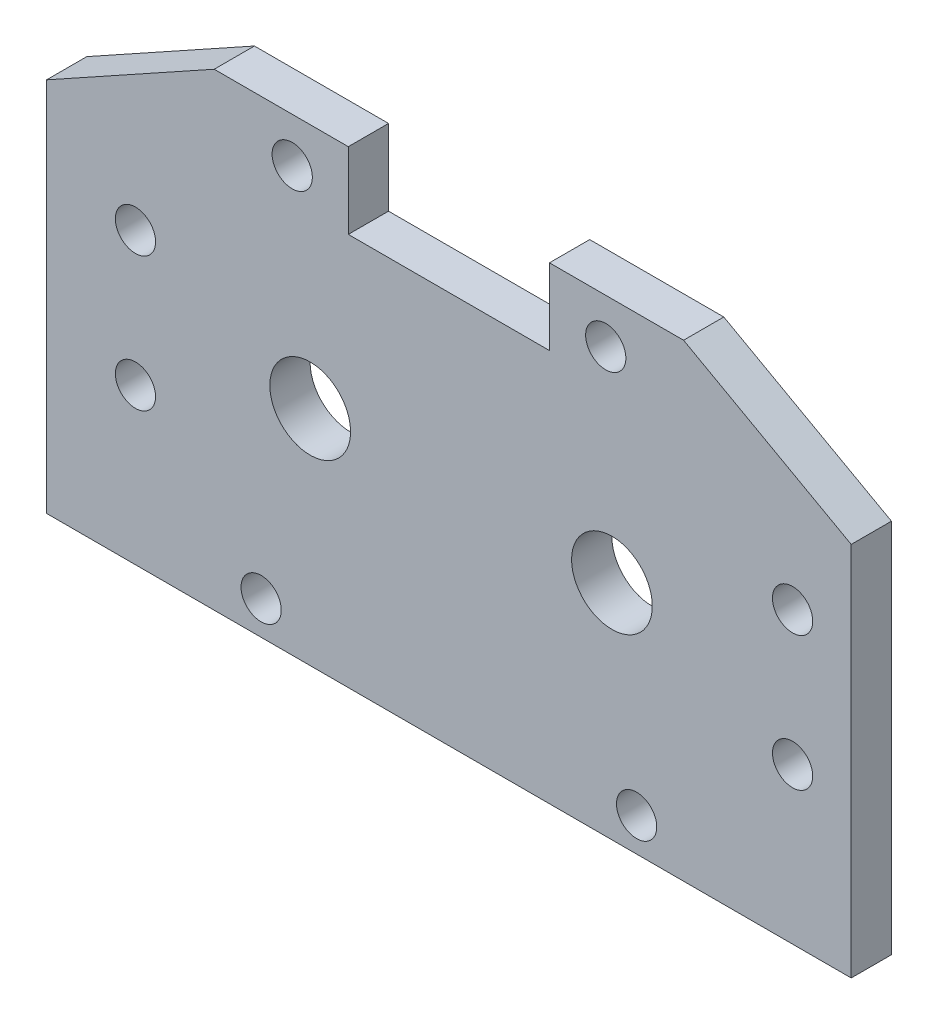
ISO-10303-21;
HEADER;
FILE_DESCRIPTION(('STEP AP214'),'2;1');
FILE_NAME('part.step','',(''),(''),'','','');
FILE_SCHEMA(('AUTOMOTIVE_DESIGN { 1 0 10303 214 1 1 1 1 }'));
ENDSEC;
DATA;
#1=APPLICATION_CONTEXT('core data for automotive mechanical design processes');
#2=APPLICATION_PROTOCOL_DEFINITION('international standard','automotive_design',2000,#1);
#3=PRODUCT_CONTEXT('',#1,'mechanical');
#4=PRODUCT('Part','Part','',(#3));
#5=PRODUCT_RELATED_PRODUCT_CATEGORY('part','',(#4));
#6=PRODUCT_DEFINITION_FORMATION('','',#4);
#7=PRODUCT_DEFINITION_CONTEXT('part definition',#1,'design');
#8=PRODUCT_DEFINITION('design','',#6,#7);
#9=PRODUCT_DEFINITION_SHAPE('','',#8);
#10=(LENGTH_UNIT() NAMED_UNIT(*) SI_UNIT(.MILLI.,.METRE.));
#11=(NAMED_UNIT(*) PLANE_ANGLE_UNIT() SI_UNIT($,.RADIAN.));
#12=(NAMED_UNIT(*) SI_UNIT($,.STERADIAN.) SOLID_ANGLE_UNIT());
#13=UNCERTAINTY_MEASURE_WITH_UNIT(LENGTH_MEASURE(1.E-05),#10,'distance_accuracy_value','');
#14=(GEOMETRIC_REPRESENTATION_CONTEXT(3) GLOBAL_UNCERTAINTY_ASSIGNED_CONTEXT((#13)) GLOBAL_UNIT_ASSIGNED_CONTEXT((#10,
#11,#12)) REPRESENTATION_CONTEXT('',''));
#15=CARTESIAN_POINT('',(0.,0.,0.));
#16=DIRECTION('',(0.,0.,1.));
#17=DIRECTION('',(1.,0.,0.));
#18=AXIS2_PLACEMENT_3D('',#15,#16,#17);
#19=CARTESIAN_POINT('',(7.5,0.,3.));
#20=DIRECTION('',(1.,0.,0.));
#21=DIRECTION('',(0.,0.,-1.));
#22=AXIS2_PLACEMENT_3D('',#19,#20,#21);
#23=PLANE('',#22);
#24=DIRECTION('',(0.,-1.,0.));
#25=VECTOR('',#24,1.);
#26=CARTESIAN_POINT('',(7.5,0.,0.));
#27=LINE('',#26,#25);
#28=CARTESIAN_POINT('',(7.5,5.66583768810425,0.));
#29=VERTEX_POINT('',#28);
#30=CARTESIAN_POINT('',(7.5,0.,0.));
#31=VERTEX_POINT('',#30);
#32=EDGE_CURVE('E146',#29,#31,#27,.T.);
#33=ORIENTED_EDGE('',*,*,#32,.T.);
#34=DIRECTION('',(0.,0.,-1.));
#35=VECTOR('',#34,1.);
#36=CARTESIAN_POINT('',(7.5,0.,3.));
#37=LINE('',#36,#35);
#38=CARTESIAN_POINT('',(7.5,0.,3.));
#39=VERTEX_POINT('',#38);
#40=EDGE_CURVE('E11',#39,#31,#37,.T.);
#41=ORIENTED_EDGE('',*,*,#40,.F.);
#42=DIRECTION('',(0.,-1.,0.));
#43=VECTOR('',#42,1.);
#44=CARTESIAN_POINT('',(7.5,0.,3.));
#45=LINE('',#44,#43);
#46=CARTESIAN_POINT('',(7.5,5.66583768810425,3.));
#47=VERTEX_POINT('',#46);
#48=EDGE_CURVE('E165',#47,#39,#45,.T.);
#49=ORIENTED_EDGE('',*,*,#48,.F.);
#50=DIRECTION('',(0.,0.,-1.));
#51=VECTOR('',#50,1.);
#52=CARTESIAN_POINT('',(7.5,5.66583768810425,3.));
#53=LINE('',#52,#51);
#54=EDGE_CURVE('E142',#47,#29,#53,.T.);
#55=ORIENTED_EDGE('',*,*,#54,.T.);
#56=EDGE_LOOP('',(#33,#41,#49,#55));
#57=FACE_BOUND('',#56,.T.);
#58=ADVANCED_FACE('F38',(#57),#23,.F.);
#59=CARTESIAN_POINT('',(-7.5,0.,3.));
#60=DIRECTION('',(0.,-1.,0.));
#61=DIRECTION('',(0.,0.,-1.));
#62=AXIS2_PLACEMENT_3D('',#59,#60,#61);
#63=PLANE('',#62);
#64=DIRECTION('',(-1.,0.,0.));
#65=VECTOR('',#64,1.);
#66=CARTESIAN_POINT('',(-7.5,0.,0.));
#67=LINE('',#66,#65);
#68=CARTESIAN_POINT('',(-7.5,0.,0.));
#69=VERTEX_POINT('',#68);
#70=EDGE_CURVE('E149',#31,#69,#67,.T.);
#71=ORIENTED_EDGE('',*,*,#70,.T.);
#72=DIRECTION('',(0.,0.,-1.));
#73=VECTOR('',#72,1.);
#74=CARTESIAN_POINT('',(-7.5,0.,3.));
#75=LINE('',#74,#73);
#76=CARTESIAN_POINT('',(-7.5,0.,3.));
#77=VERTEX_POINT('',#76);
#78=EDGE_CURVE('E46',#77,#69,#75,.T.);
#79=ORIENTED_EDGE('',*,*,#78,.F.);
#80=DIRECTION('',(-1.,0.,0.));
#81=VECTOR('',#80,1.);
#82=CARTESIAN_POINT('',(-7.5,0.,3.));
#83=LINE('',#82,#81);
#84=EDGE_CURVE('E103',#39,#77,#83,.T.);
#85=ORIENTED_EDGE('',*,*,#84,.F.);
#86=ORIENTED_EDGE('',*,*,#40,.T.);
#87=EDGE_LOOP('',(#71,#79,#85,#86));
#88=FACE_BOUND('',#87,.T.);
#89=ADVANCED_FACE('F318',(#88),#63,.F.);
#90=CARTESIAN_POINT('',(-7.5,0.,3.));
#91=DIRECTION('',(-1.,0.,0.));
#92=DIRECTION('',(0.,0.,1.));
#93=AXIS2_PLACEMENT_3D('',#90,#91,#92);
#94=PLANE('',#93);
#95=DIRECTION('',(0.,1.,0.));
#96=VECTOR('',#95,1.);
#97=CARTESIAN_POINT('',(-7.5,0.,0.));
#98=LINE('',#97,#96);
#99=CARTESIAN_POINT('',(-7.5,5.66583768810425,0.));
#100=VERTEX_POINT('',#99);
#101=EDGE_CURVE('E152',#69,#100,#98,.T.);
#102=ORIENTED_EDGE('',*,*,#101,.T.);
#103=DIRECTION('',(0.,0.,-1.));
#104=VECTOR('',#103,1.);
#105=CARTESIAN_POINT('',(-7.5,5.66583768810425,3.));
#106=LINE('',#105,#104);
#107=CARTESIAN_POINT('',(-7.5,5.66583768810425,3.));
#108=VERTEX_POINT('',#107);
#109=EDGE_CURVE('E178',#108,#100,#106,.T.);
#110=ORIENTED_EDGE('',*,*,#109,.F.);
#111=DIRECTION('',(0.,1.,0.));
#112=VECTOR('',#111,1.);
#113=CARTESIAN_POINT('',(-7.5,0.,3.));
#114=LINE('',#113,#112);
#115=EDGE_CURVE('E186',#77,#108,#114,.T.);
#116=ORIENTED_EDGE('',*,*,#115,.F.);
#117=ORIENTED_EDGE('',*,*,#78,.T.);
#118=EDGE_LOOP('',(#102,#110,#116,#117));
#119=FACE_BOUND('',#118,.T.);
#120=ADVANCED_FACE('F184',(#119),#94,.F.);
#121=CARTESIAN_POINT('',(-7.5,5.66583768810425,3.));
#122=DIRECTION('',(0.,-1.,0.));
#123=DIRECTION('',(1.,0.,0.));
#124=AXIS2_PLACEMENT_3D('',#121,#122,#123);
#125=PLANE('',#124);
#126=DIRECTION('',(-1.,0.,0.));
#127=VECTOR('',#126,1.);
#128=CARTESIAN_POINT('',(-7.5,5.66583768810425,0.));
#129=LINE('',#128,#127);
#130=CARTESIAN_POINT('',(-17.5,5.66583768810424,0.));
#131=VERTEX_POINT('',#130);
#132=EDGE_CURVE('E154',#100,#131,#129,.T.);
#133=ORIENTED_EDGE('',*,*,#132,.T.);
#134=DIRECTION('',(0.,0.,-1.));
#135=VECTOR('',#134,1.);
#136=CARTESIAN_POINT('',(-17.5,5.66583768810424,3.));
#137=LINE('',#136,#135);
#138=CARTESIAN_POINT('',(-17.5,5.66583768810424,3.));
#139=VERTEX_POINT('',#138);
#140=EDGE_CURVE('E175',#139,#131,#137,.T.);
#141=ORIENTED_EDGE('',*,*,#140,.F.);
#142=DIRECTION('',(-1.,0.,0.));
#143=VECTOR('',#142,1.);
#144=CARTESIAN_POINT('',(-7.5,5.66583768810425,3.));
#145=LINE('',#144,#143);
#146=EDGE_CURVE('E204',#108,#139,#145,.T.);
#147=ORIENTED_EDGE('',*,*,#146,.F.);
#148=ORIENTED_EDGE('',*,*,#109,.T.);
#149=EDGE_LOOP('',(#133,#141,#147,#148));
#150=FACE_BOUND('',#149,.T.);
#151=ADVANCED_FACE('F195',(#150),#125,.F.);
#152=CARTESIAN_POINT('',(-17.5,5.66583768810424,3.));
#153=DIRECTION('',(0.485146223738787,-0.874433040084828,0.));
#154=DIRECTION('',(0.874433040084828,0.485146223738787,0.));
#155=AXIS2_PLACEMENT_3D('',#152,#153,#154);
#156=PLANE('',#155);
#157=DIRECTION('',(-0.874433040084828,-0.485146223738787,0.));
#158=VECTOR('',#157,1.);
#159=CARTESIAN_POINT('',(-17.5,5.66583768810424,0.));
#160=LINE('',#159,#158);
#161=CARTESIAN_POINT('',(-30.,-1.26931631310612,0.));
#162=VERTEX_POINT('',#161);
#163=EDGE_CURVE('E156',#131,#162,#160,.T.);
#164=ORIENTED_EDGE('',*,*,#163,.T.);
#165=DIRECTION('',(0.,0.,-1.));
#166=VECTOR('',#165,1.);
#167=CARTESIAN_POINT('',(-30.,-1.26931631310612,3.));
#168=LINE('',#167,#166);
#169=CARTESIAN_POINT('',(-30.,-1.26931631310612,3.));
#170=VERTEX_POINT('',#169);
#171=EDGE_CURVE('E172',#170,#162,#168,.T.);
#172=ORIENTED_EDGE('',*,*,#171,.F.);
#173=DIRECTION('',(-0.874433040084828,-0.485146223738787,0.));
#174=VECTOR('',#173,1.);
#175=CARTESIAN_POINT('',(-17.5,5.66583768810424,3.));
#176=LINE('',#175,#174);
#177=EDGE_CURVE('E201',#139,#170,#176,.T.);
#178=ORIENTED_EDGE('',*,*,#177,.F.);
#179=ORIENTED_EDGE('',*,*,#140,.T.);
#180=EDGE_LOOP('',(#164,#172,#178,#179));
#181=FACE_BOUND('',#180,.T.);
#182=ADVANCED_FACE('F199',(#181),#156,.F.);
#183=CARTESIAN_POINT('',(-30.,-1.26931631310612,3.));
#184=DIRECTION('',(1.,0.,0.));
#185=DIRECTION('',(0.,1.,0.));
#186=AXIS2_PLACEMENT_3D('',#183,#184,#185);
#187=PLANE('',#186);
#188=DIRECTION('',(0.,-1.,0.));
#189=VECTOR('',#188,1.);
#190=CARTESIAN_POINT('',(-30.,-1.26931631310612,0.));
#191=LINE('',#190,#189);
#192=CARTESIAN_POINT('',(-30.,-29.2693163131061,0.));
#193=VERTEX_POINT('',#192);
#194=EDGE_CURVE('E158',#162,#193,#191,.T.);
#195=ORIENTED_EDGE('',*,*,#194,.T.);
#196=DIRECTION('',(0.,0.,-1.));
#197=VECTOR('',#196,1.);
#198=CARTESIAN_POINT('',(-30.,-29.2693163131061,3.));
#199=LINE('',#198,#197);
#200=CARTESIAN_POINT('',(-30.,-29.2693163131061,3.));
#201=VERTEX_POINT('',#200);
#202=EDGE_CURVE('E169',#201,#193,#199,.T.);
#203=ORIENTED_EDGE('',*,*,#202,.F.);
#204=DIRECTION('',(0.,-1.,0.));
#205=VECTOR('',#204,1.);
#206=CARTESIAN_POINT('',(-30.,-1.26931631310612,3.));
#207=LINE('',#206,#205);
#208=EDGE_CURVE('E203',#170,#201,#207,.T.);
#209=ORIENTED_EDGE('',*,*,#208,.F.);
#210=ORIENTED_EDGE('',*,*,#171,.T.);
#211=EDGE_LOOP('',(#195,#203,#209,#210));
#212=FACE_BOUND('',#211,.T.);
#213=ADVANCED_FACE('F330',(#212),#187,.F.);
#214=CARTESIAN_POINT('',(30.,-29.2693163131061,3.));
#215=DIRECTION('',(0.,1.,0.));
#216=DIRECTION('',(-1.,0.,0.));
#217=AXIS2_PLACEMENT_3D('',#214,#215,#216);
#218=PLANE('',#217);
#219=DIRECTION('',(1.,0.,0.));
#220=VECTOR('',#219,1.);
#221=CARTESIAN_POINT('',(30.,-29.2693163131061,0.));
#222=LINE('',#221,#220);
#223=CARTESIAN_POINT('',(30.,-29.2693163131061,0.));
#224=VERTEX_POINT('',#223);
#225=EDGE_CURVE('E160',#193,#224,#222,.T.);
#226=ORIENTED_EDGE('',*,*,#225,.T.);
#227=DIRECTION('',(0.,0.,-1.));
#228=VECTOR('',#227,1.);
#229=CARTESIAN_POINT('',(30.,-29.2693163131061,3.));
#230=LINE('',#229,#228);
#231=CARTESIAN_POINT('',(30.,-29.2693163131061,3.));
#232=VERTEX_POINT('',#231);
#233=EDGE_CURVE('E137',#232,#224,#230,.T.);
#234=ORIENTED_EDGE('',*,*,#233,.F.);
#235=DIRECTION('',(1.,0.,0.));
#236=VECTOR('',#235,1.);
#237=CARTESIAN_POINT('',(30.,-29.2693163131061,3.));
#238=LINE('',#237,#236);
#239=EDGE_CURVE('E128',#201,#232,#238,.T.);
#240=ORIENTED_EDGE('',*,*,#239,.F.);
#241=ORIENTED_EDGE('',*,*,#202,.T.);
#242=EDGE_LOOP('',(#226,#234,#240,#241));
#243=FACE_BOUND('',#242,.T.);
#244=ADVANCED_FACE('F327',(#243),#218,.F.);
#245=CARTESIAN_POINT('',(30.,-1.26931631310611,3.));
#246=DIRECTION('',(-1.,0.,0.));
#247=DIRECTION('',(0.,-1.,0.));
#248=AXIS2_PLACEMENT_3D('',#245,#246,#247);
#249=PLANE('',#248);
#250=DIRECTION('',(0.,1.,0.));
#251=VECTOR('',#250,1.);
#252=CARTESIAN_POINT('',(30.,-1.26931631310611,0.));
#253=LINE('',#252,#251);
#254=CARTESIAN_POINT('',(30.,-1.26931631310611,0.));
#255=VERTEX_POINT('',#254);
#256=EDGE_CURVE('E136',#224,#255,#253,.T.);
#257=ORIENTED_EDGE('',*,*,#256,.T.);
#258=DIRECTION('',(0.,0.,-1.));
#259=VECTOR('',#258,1.);
#260=CARTESIAN_POINT('',(30.,-1.26931631310611,3.));
#261=LINE('',#260,#259);
#262=CARTESIAN_POINT('',(30.,-1.26931631310611,3.));
#263=VERTEX_POINT('',#262);
#264=EDGE_CURVE('E133',#263,#255,#261,.T.);
#265=ORIENTED_EDGE('',*,*,#264,.F.);
#266=DIRECTION('',(0.,1.,0.));
#267=VECTOR('',#266,1.);
#268=CARTESIAN_POINT('',(30.,-1.26931631310611,3.));
#269=LINE('',#268,#267);
#270=EDGE_CURVE('E122',#232,#263,#269,.T.);
#271=ORIENTED_EDGE('',*,*,#270,.F.);
#272=ORIENTED_EDGE('',*,*,#233,.T.);
#273=EDGE_LOOP('',(#257,#265,#271,#272));
#274=FACE_BOUND('',#273,.T.);
#275=ADVANCED_FACE('F134',(#274),#249,.F.);
#276=CARTESIAN_POINT('',(17.5,5.66583768810425,3.));
#277=DIRECTION('',(-0.485146223738787,-0.874433040084828,0.));
#278=DIRECTION('',(0.874433040084828,-0.485146223738787,0.));
#279=AXIS2_PLACEMENT_3D('',#276,#277,#278);
#280=PLANE('',#279);
#281=DIRECTION('',(-0.874433040084828,0.485146223738787,0.));
#282=VECTOR('',#281,1.);
#283=CARTESIAN_POINT('',(17.5,5.66583768810425,0.));
#284=LINE('',#283,#282);
#285=CARTESIAN_POINT('',(17.5,5.66583768810425,0.));
#286=VERTEX_POINT('',#285);
#287=EDGE_CURVE('E89',#255,#286,#284,.T.);
#288=ORIENTED_EDGE('',*,*,#287,.T.);
#289=DIRECTION('',(0.,0.,-1.));
#290=VECTOR('',#289,1.);
#291=CARTESIAN_POINT('',(17.5,5.66583768810425,3.));
#292=LINE('',#291,#290);
#293=CARTESIAN_POINT('',(17.5,5.66583768810425,3.));
#294=VERTEX_POINT('',#293);
#295=EDGE_CURVE('E138',#294,#286,#292,.T.);
#296=ORIENTED_EDGE('',*,*,#295,.F.);
#297=DIRECTION('',(-0.874433040084828,0.485146223738787,0.));
#298=VECTOR('',#297,1.);
#299=CARTESIAN_POINT('',(17.5,5.66583768810425,3.));
#300=LINE('',#299,#298);
#301=EDGE_CURVE('E126',#263,#294,#300,.T.);
#302=ORIENTED_EDGE('',*,*,#301,.F.);
#303=ORIENTED_EDGE('',*,*,#264,.T.);
#304=EDGE_LOOP('',(#288,#296,#302,#303));
#305=FACE_BOUND('',#304,.T.);
#306=ADVANCED_FACE('F140',(#305),#280,.F.);
#307=CARTESIAN_POINT('',(7.5,5.66583768810425,3.));
#308=DIRECTION('',(0.,-1.,0.));
#309=DIRECTION('',(0.,0.,-1.));
#310=AXIS2_PLACEMENT_3D('',#307,#308,#309);
#311=PLANE('',#310);
#312=DIRECTION('',(-1.,0.,0.));
#313=VECTOR('',#312,1.);
#314=CARTESIAN_POINT('',(7.5,5.66583768810425,0.));
#315=LINE('',#314,#313);
#316=EDGE_CURVE('E95',#286,#29,#315,.T.);
#317=ORIENTED_EDGE('',*,*,#316,.T.);
#318=ORIENTED_EDGE('',*,*,#54,.F.);
#319=DIRECTION('',(-1.,0.,0.));
#320=VECTOR('',#319,1.);
#321=CARTESIAN_POINT('',(7.5,5.66583768810425,3.));
#322=LINE('',#321,#320);
#323=EDGE_CURVE('E54',#294,#47,#322,.T.);
#324=ORIENTED_EDGE('',*,*,#323,.F.);
#325=ORIENTED_EDGE('',*,*,#295,.T.);
#326=EDGE_LOOP('',(#317,#318,#324,#325));
#327=FACE_BOUND('',#326,.T.);
#328=ADVANCED_FACE('F382',(#327),#311,.F.);
#329=CARTESIAN_POINT('',(0.,0.,3.));
#330=DIRECTION('',(0.,0.,-1.));
#331=DIRECTION('',(-1.,0.,0.));
#332=AXIS2_PLACEMENT_3D('',#329,#330,#331);
#333=PLANE('',#332);
#334=CARTESIAN_POINT('',(-14.,-26.7693163131061,3.));
#335=DIRECTION('',(0.,0.,-1.));
#336=DIRECTION('',(-1.,0.,0.));
#337=AXIS2_PLACEMENT_3D('',#334,#335,#336);
#338=CIRCLE('',#337,1.5);
#339=CARTESIAN_POINT('',(-15.5,-26.7693163131061,3.));
#340=VERTEX_POINT('',#339);
#341=EDGE_CURVE('E252',#340,#340,#338,.T.);
#342=ORIENTED_EDGE('',*,*,#341,.T.);
#343=EDGE_LOOP('',(#342));
#344=FACE_BOUND('',#343,.T.);
#345=CARTESIAN_POINT('',(14.,-26.7693163131061,3.));
#346=DIRECTION('',(0.,0.,-1.));
#347=DIRECTION('',(-1.,0.,0.));
#348=AXIS2_PLACEMENT_3D('',#345,#346,#347);
#349=CIRCLE('',#348,1.5);
#350=CARTESIAN_POINT('',(12.5,-26.7693163131061,3.));
#351=VERTEX_POINT('',#350);
#352=EDGE_CURVE('E263',#351,#351,#349,.T.);
#353=ORIENTED_EDGE('',*,*,#352,.T.);
#354=EDGE_LOOP('',(#353));
#355=FACE_BOUND('',#354,.T.);
#356=CARTESIAN_POINT('',(-10.3415528202247,-12.6693163131061,3.));
#357=DIRECTION('',(0.,0.,-1.));
#358=DIRECTION('',(-1.,0.,0.));
#359=AXIS2_PLACEMENT_3D('',#356,#357,#358);
#360=CIRCLE('',#359,3.01000000000002);
#361=CARTESIAN_POINT('',(-13.3515528202248,-12.6693163131061,3.));
#362=VERTEX_POINT('',#361);
#363=EDGE_CURVE('E240',#362,#362,#360,.T.);
#364=ORIENTED_EDGE('',*,*,#363,.T.);
#365=EDGE_LOOP('',(#364));
#366=FACE_BOUND('',#365,.T.);
#367=CARTESIAN_POINT('',(12.1584471796846,-12.6693801884365,3.));
#368=DIRECTION('',(0.,0.,-1.));
#369=DIRECTION('',(-1.,0.,0.));
#370=AXIS2_PLACEMENT_3D('',#367,#368,#369);
#371=CIRCLE('',#370,3.01);
#372=CARTESIAN_POINT('',(9.14844717968459,-12.6693801884365,3.));
#373=VERTEX_POINT('',#372);
#374=EDGE_CURVE('E251',#373,#373,#371,.T.);
#375=ORIENTED_EDGE('',*,*,#374,.T.);
#376=EDGE_LOOP('',(#375));
#377=FACE_BOUND('',#376,.T.);
#378=CARTESIAN_POINT('',(11.6968329642972,2.35034329740187,3.));
#379=DIRECTION('',(0.,0.,-1.));
#380=DIRECTION('',(-1.,0.,0.));
#381=AXIS2_PLACEMENT_3D('',#378,#379,#380);
#382=CIRCLE('',#381,1.5);
#383=CARTESIAN_POINT('',(10.1968329642972,2.35034329740187,3.));
#384=VERTEX_POINT('',#383);
#385=EDGE_CURVE('E233',#384,#384,#382,.T.);
#386=ORIENTED_EDGE('',*,*,#385,.T.);
#387=EDGE_LOOP('',(#386));
#388=FACE_BOUND('',#387,.T.);
#389=CARTESIAN_POINT('',(-11.6821646357028,2.35034329740185,3.));
#390=DIRECTION('',(0.,0.,-1.));
#391=DIRECTION('',(-1.,0.,0.));
#392=AXIS2_PLACEMENT_3D('',#389,#390,#391);
#393=CIRCLE('',#392,1.5);
#394=CARTESIAN_POINT('',(-13.1821646357028,2.35034329740185,3.));
#395=VERTEX_POINT('',#394);
#396=EDGE_CURVE('E239',#395,#395,#393,.T.);
#397=ORIENTED_EDGE('',*,*,#396,.T.);
#398=EDGE_LOOP('',(#397));
#399=FACE_BOUND('',#398,.T.);
#400=CARTESIAN_POINT('',(25.6284471796846,-7.66938018843653,3.));
#401=DIRECTION('',(0.,0.,-1.));
#402=DIRECTION('',(-1.,0.,0.));
#403=AXIS2_PLACEMENT_3D('',#400,#401,#402);
#404=CIRCLE('',#403,1.5);
#405=CARTESIAN_POINT('',(24.1284471796846,-7.66938018843653,3.));
#406=VERTEX_POINT('',#405);
#407=EDGE_CURVE('E215',#406,#406,#404,.T.);
#408=ORIENTED_EDGE('',*,*,#407,.T.);
#409=EDGE_LOOP('',(#408));
#410=FACE_BOUND('',#409,.T.);
#411=CARTESIAN_POINT('',(-23.3715528203154,-17.6693801884365,3.));
#412=DIRECTION('',(0.,0.,-1.));
#413=DIRECTION('',(-1.,0.,0.));
#414=AXIS2_PLACEMENT_3D('',#411,#412,#413);
#415=CIRCLE('',#414,1.5);
#416=CARTESIAN_POINT('',(-24.8715528203154,-17.6693801884365,3.));
#417=VERTEX_POINT('',#416);
#418=EDGE_CURVE('E221',#417,#417,#415,.T.);
#419=ORIENTED_EDGE('',*,*,#418,.T.);
#420=EDGE_LOOP('',(#419));
#421=FACE_BOUND('',#420,.T.);
#422=CARTESIAN_POINT('',(-23.3715528203154,-7.66938018843654,3.));
#423=DIRECTION('',(0.,0.,-1.));
#424=DIRECTION('',(-1.,0.,0.));
#425=AXIS2_PLACEMENT_3D('',#422,#423,#424);
#426=CIRCLE('',#425,1.5);
#427=CARTESIAN_POINT('',(-24.8715528203154,-7.66938018843654,3.));
#428=VERTEX_POINT('',#427);
#429=EDGE_CURVE('E222',#428,#428,#426,.T.);
#430=ORIENTED_EDGE('',*,*,#429,.T.);
#431=EDGE_LOOP('',(#430));
#432=FACE_BOUND('',#431,.T.);
#433=CARTESIAN_POINT('',(25.6284471796846,-17.6693801884365,3.));
#434=DIRECTION('',(0.,0.,-1.));
#435=DIRECTION('',(-1.,0.,0.));
#436=AXIS2_PLACEMENT_3D('',#433,#434,#435);
#437=CIRCLE('',#436,1.5);
#438=CARTESIAN_POINT('',(24.1284471796846,-17.6693801884365,3.));
#439=VERTEX_POINT('',#438);
#440=EDGE_CURVE('E150',#439,#439,#437,.T.);
#441=ORIENTED_EDGE('',*,*,#440,.T.);
#442=EDGE_LOOP('',(#441));
#443=FACE_BOUND('',#442,.T.);
#444=ORIENTED_EDGE('',*,*,#48,.T.);
#445=ORIENTED_EDGE('',*,*,#84,.T.);
#446=ORIENTED_EDGE('',*,*,#115,.T.);
#447=ORIENTED_EDGE('',*,*,#146,.T.);
#448=ORIENTED_EDGE('',*,*,#177,.T.);
#449=ORIENTED_EDGE('',*,*,#208,.T.);
#450=ORIENTED_EDGE('',*,*,#239,.T.);
#451=ORIENTED_EDGE('',*,*,#270,.T.);
#452=ORIENTED_EDGE('',*,*,#301,.T.);
#453=ORIENTED_EDGE('',*,*,#323,.T.);
#454=EDGE_LOOP('',(#444,#445,#446,#447,#448,#449,#450,#451,#452,#453));
#455=FACE_BOUND('',#454,.T.);
#456=ADVANCED_FACE('F124',(#344,#355,#366,#377,#388,#399,#410,#421,#432,#443,#455),#333,.F.);
#457=CARTESIAN_POINT('',(0.,0.,0.));
#458=DIRECTION('',(0.,0.,-1.));
#459=DIRECTION('',(-1.,0.,0.));
#460=AXIS2_PLACEMENT_3D('',#457,#458,#459);
#461=PLANE('',#460);
#462=CARTESIAN_POINT('',(-14.,-26.7693163131061,0.));
#463=DIRECTION('',(0.,0.,-1.));
#464=DIRECTION('',(-1.,0.,0.));
#465=AXIS2_PLACEMENT_3D('',#462,#463,#464);
#466=CIRCLE('',#465,1.5);
#467=CARTESIAN_POINT('',(-15.5,-26.7693163131061,0.));
#468=VERTEX_POINT('',#467);
#469=EDGE_CURVE('E266',#468,#468,#466,.T.);
#470=ORIENTED_EDGE('',*,*,#469,.F.);
#471=EDGE_LOOP('',(#470));
#472=FACE_BOUND('',#471,.T.);
#473=CARTESIAN_POINT('',(14.,-26.7693163131061,0.));
#474=DIRECTION('',(0.,0.,-1.));
#475=DIRECTION('',(-1.,0.,0.));
#476=AXIS2_PLACEMENT_3D('',#473,#474,#475);
#477=CIRCLE('',#476,1.5);
#478=CARTESIAN_POINT('',(12.5,-26.7693163131061,0.));
#479=VERTEX_POINT('',#478);
#480=EDGE_CURVE('E260',#479,#479,#477,.T.);
#481=ORIENTED_EDGE('',*,*,#480,.F.);
#482=EDGE_LOOP('',(#481));
#483=FACE_BOUND('',#482,.T.);
#484=CARTESIAN_POINT('',(-10.3415528202247,-12.6693163131061,0.));
#485=DIRECTION('',(0.,0.,-1.));
#486=DIRECTION('',(-1.,0.,0.));
#487=AXIS2_PLACEMENT_3D('',#484,#485,#486);
#488=CIRCLE('',#487,3.01000000000002);
#489=CARTESIAN_POINT('',(-13.3515528202248,-12.6693163131061,0.));
#490=VERTEX_POINT('',#489);
#491=EDGE_CURVE('E255',#490,#490,#488,.T.);
#492=ORIENTED_EDGE('',*,*,#491,.F.);
#493=EDGE_LOOP('',(#492));
#494=FACE_BOUND('',#493,.T.);
#495=CARTESIAN_POINT('',(12.1584471796846,-12.6693801884365,0.));
#496=DIRECTION('',(0.,0.,-1.));
#497=DIRECTION('',(-1.,0.,0.));
#498=AXIS2_PLACEMENT_3D('',#495,#496,#497);
#499=CIRCLE('',#498,3.01);
#500=CARTESIAN_POINT('',(9.14844717968459,-12.6693801884365,0.));
#501=VERTEX_POINT('',#500);
#502=EDGE_CURVE('E248',#501,#501,#499,.T.);
#503=ORIENTED_EDGE('',*,*,#502,.F.);
#504=EDGE_LOOP('',(#503));
#505=FACE_BOUND('',#504,.T.);
#506=CARTESIAN_POINT('',(11.6968329642972,2.35034329740187,0.));
#507=DIRECTION('',(0.,0.,-1.));
#508=DIRECTION('',(-1.,0.,0.));
#509=AXIS2_PLACEMENT_3D('',#506,#507,#508);
#510=CIRCLE('',#509,1.5);
#511=CARTESIAN_POINT('',(10.1968329642972,2.35034329740187,0.));
#512=VERTEX_POINT('',#511);
#513=EDGE_CURVE('E243',#512,#512,#510,.T.);
#514=ORIENTED_EDGE('',*,*,#513,.F.);
#515=EDGE_LOOP('',(#514));
#516=FACE_BOUND('',#515,.T.);
#517=CARTESIAN_POINT('',(-11.6821646357028,2.35034329740185,0.));
#518=DIRECTION('',(0.,0.,-1.));
#519=DIRECTION('',(-1.,0.,0.));
#520=AXIS2_PLACEMENT_3D('',#517,#518,#519);
#521=CIRCLE('',#520,1.5);
#522=CARTESIAN_POINT('',(-13.1821646357028,2.35034329740185,0.));
#523=VERTEX_POINT('',#522);
#524=EDGE_CURVE('E236',#523,#523,#521,.T.);
#525=ORIENTED_EDGE('',*,*,#524,.F.);
#526=EDGE_LOOP('',(#525));
#527=FACE_BOUND('',#526,.T.);
#528=CARTESIAN_POINT('',(25.6284471796846,-7.66938018843653,0.));
#529=DIRECTION('',(0.,0.,-1.));
#530=DIRECTION('',(-1.,0.,0.));
#531=AXIS2_PLACEMENT_3D('',#528,#529,#530);
#532=CIRCLE('',#531,1.5);
#533=CARTESIAN_POINT('',(24.1284471796846,-7.66938018843653,0.));
#534=VERTEX_POINT('',#533);
#535=EDGE_CURVE('E225',#534,#534,#532,.T.);
#536=ORIENTED_EDGE('',*,*,#535,.F.);
#537=EDGE_LOOP('',(#536));
#538=FACE_BOUND('',#537,.T.);
#539=CARTESIAN_POINT('',(-23.3715528203154,-17.6693801884365,0.));
#540=DIRECTION('',(0.,0.,-1.));
#541=DIRECTION('',(-1.,0.,0.));
#542=AXIS2_PLACEMENT_3D('',#539,#540,#541);
#543=CIRCLE('',#542,1.5);
#544=CARTESIAN_POINT('',(-24.8715528203154,-17.6693801884365,0.));
#545=VERTEX_POINT('',#544);
#546=EDGE_CURVE('E218',#545,#545,#543,.T.);
#547=ORIENTED_EDGE('',*,*,#546,.F.);
#548=EDGE_LOOP('',(#547));
#549=FACE_BOUND('',#548,.T.);
#550=CARTESIAN_POINT('',(-23.3715528203154,-7.66938018843654,0.));
#551=DIRECTION('',(0.,0.,-1.));
#552=DIRECTION('',(-1.,0.,0.));
#553=AXIS2_PLACEMENT_3D('',#550,#551,#552);
#554=CIRCLE('',#553,1.5);
#555=CARTESIAN_POINT('',(-24.8715528203154,-7.66938018843654,0.));
#556=VERTEX_POINT('',#555);
#557=EDGE_CURVE('E230',#556,#556,#554,.T.);
#558=ORIENTED_EDGE('',*,*,#557,.F.);
#559=EDGE_LOOP('',(#558));
#560=FACE_BOUND('',#559,.T.);
#561=CARTESIAN_POINT('',(25.6284471796846,-17.6693801884365,0.));
#562=DIRECTION('',(0.,0.,-1.));
#563=DIRECTION('',(-1.,0.,0.));
#564=AXIS2_PLACEMENT_3D('',#561,#562,#563);
#565=CIRCLE('',#564,1.5);
#566=CARTESIAN_POINT('',(24.1284471796846,-17.6693801884365,0.));
#567=VERTEX_POINT('',#566);
#568=EDGE_CURVE('E212',#567,#567,#565,.T.);
#569=ORIENTED_EDGE('',*,*,#568,.F.);
#570=EDGE_LOOP('',(#569));
#571=FACE_BOUND('',#570,.T.);
#572=ORIENTED_EDGE('',*,*,#32,.F.);
#573=ORIENTED_EDGE('',*,*,#316,.F.);
#574=ORIENTED_EDGE('',*,*,#287,.F.);
#575=ORIENTED_EDGE('',*,*,#256,.F.);
#576=ORIENTED_EDGE('',*,*,#225,.F.);
#577=ORIENTED_EDGE('',*,*,#194,.F.);
#578=ORIENTED_EDGE('',*,*,#163,.F.);
#579=ORIENTED_EDGE('',*,*,#132,.F.);
#580=ORIENTED_EDGE('',*,*,#101,.F.);
#581=ORIENTED_EDGE('',*,*,#70,.F.);
#582=EDGE_LOOP('',(#572,#573,#574,#575,#576,#577,#578,#579,#580,#581));
#583=FACE_BOUND('',#582,.T.);
#584=ADVANCED_FACE('F190',(#472,#483,#494,#505,#516,#527,#538,#549,#560,#571,#583),#461,.T.);
#585=CARTESIAN_POINT('',(25.6284471796846,-17.6693801884365,3.));
#586=DIRECTION('',(0.,0.,-1.));
#587=DIRECTION('',(-1.,0.,0.));
#588=AXIS2_PLACEMENT_3D('',#585,#586,#587);
#589=CYLINDRICAL_SURFACE('',#588,1.5);
#590=ORIENTED_EDGE('',*,*,#440,.F.);
#591=EDGE_LOOP('',(#590));
#592=FACE_BOUND('',#591,.T.);
#593=ORIENTED_EDGE('',*,*,#568,.T.);
#594=EDGE_LOOP('',(#593));
#595=FACE_BOUND('',#594,.T.);
#596=ADVANCED_FACE('F283',(#592,#595),#589,.F.);
#597=CARTESIAN_POINT('',(-23.3715528203154,-7.66938018843654,3.));
#598=DIRECTION('',(0.,0.,-1.));
#599=DIRECTION('',(-1.,0.,0.));
#600=AXIS2_PLACEMENT_3D('',#597,#598,#599);
#601=CYLINDRICAL_SURFACE('',#600,1.5);
#602=ORIENTED_EDGE('',*,*,#429,.F.);
#603=EDGE_LOOP('',(#602));
#604=FACE_BOUND('',#603,.T.);
#605=ORIENTED_EDGE('',*,*,#557,.T.);
#606=EDGE_LOOP('',(#605));
#607=FACE_BOUND('',#606,.T.);
#608=ADVANCED_FACE('F304',(#604,#607),#601,.F.);
#609=CARTESIAN_POINT('',(-23.3715528203154,-17.6693801884365,3.));
#610=DIRECTION('',(0.,0.,-1.));
#611=DIRECTION('',(-1.,0.,0.));
#612=AXIS2_PLACEMENT_3D('',#609,#610,#611);
#613=CYLINDRICAL_SURFACE('',#612,1.5);
#614=ORIENTED_EDGE('',*,*,#418,.F.);
#615=EDGE_LOOP('',(#614));
#616=FACE_BOUND('',#615,.T.);
#617=ORIENTED_EDGE('',*,*,#546,.T.);
#618=EDGE_LOOP('',(#617));
#619=FACE_BOUND('',#618,.T.);
#620=ADVANCED_FACE('F311',(#616,#619),#613,.F.);
#621=CARTESIAN_POINT('',(25.6284471796846,-7.66938018843653,3.));
#622=DIRECTION('',(0.,0.,-1.));
#623=DIRECTION('',(-1.,0.,0.));
#624=AXIS2_PLACEMENT_3D('',#621,#622,#623);
#625=CYLINDRICAL_SURFACE('',#624,1.5);
#626=ORIENTED_EDGE('',*,*,#407,.F.);
#627=EDGE_LOOP('',(#626));
#628=FACE_BOUND('',#627,.T.);
#629=ORIENTED_EDGE('',*,*,#535,.T.);
#630=EDGE_LOOP('',(#629));
#631=FACE_BOUND('',#630,.T.);
#632=ADVANCED_FACE('F412',(#628,#631),#625,.F.);
#633=CARTESIAN_POINT('',(-11.6821646357028,2.35034329740185,3.));
#634=DIRECTION('',(0.,0.,-1.));
#635=DIRECTION('',(-1.,0.,0.));
#636=AXIS2_PLACEMENT_3D('',#633,#634,#635);
#637=CYLINDRICAL_SURFACE('',#636,1.5);
#638=ORIENTED_EDGE('',*,*,#396,.F.);
#639=EDGE_LOOP('',(#638));
#640=FACE_BOUND('',#639,.T.);
#641=ORIENTED_EDGE('',*,*,#524,.T.);
#642=EDGE_LOOP('',(#641));
#643=FACE_BOUND('',#642,.T.);
#644=ADVANCED_FACE('F421',(#640,#643),#637,.F.);
#645=CARTESIAN_POINT('',(11.6968329642972,2.35034329740187,3.));
#646=DIRECTION('',(0.,0.,-1.));
#647=DIRECTION('',(-1.,0.,0.));
#648=AXIS2_PLACEMENT_3D('',#645,#646,#647);
#649=CYLINDRICAL_SURFACE('',#648,1.5);
#650=ORIENTED_EDGE('',*,*,#385,.F.);
#651=EDGE_LOOP('',(#650));
#652=FACE_BOUND('',#651,.T.);
#653=ORIENTED_EDGE('',*,*,#513,.T.);
#654=EDGE_LOOP('',(#653));
#655=FACE_BOUND('',#654,.T.);
#656=ADVANCED_FACE('F431',(#652,#655),#649,.F.);
#657=CARTESIAN_POINT('',(12.1584471796846,-12.6693801884365,3.));
#658=DIRECTION('',(0.,0.,-1.));
#659=DIRECTION('',(-1.,0.,0.));
#660=AXIS2_PLACEMENT_3D('',#657,#658,#659);
#661=CYLINDRICAL_SURFACE('',#660,3.01);
#662=ORIENTED_EDGE('',*,*,#374,.F.);
#663=EDGE_LOOP('',(#662));
#664=FACE_BOUND('',#663,.T.);
#665=ORIENTED_EDGE('',*,*,#502,.T.);
#666=EDGE_LOOP('',(#665));
#667=FACE_BOUND('',#666,.T.);
#668=ADVANCED_FACE('F441',(#664,#667),#661,.F.);
#669=CARTESIAN_POINT('',(-10.3415528202247,-12.6693163131061,3.));
#670=DIRECTION('',(0.,0.,-1.));
#671=DIRECTION('',(-1.,0.,0.));
#672=AXIS2_PLACEMENT_3D('',#669,#670,#671);
#673=CYLINDRICAL_SURFACE('',#672,3.01000000000002);
#674=ORIENTED_EDGE('',*,*,#363,.F.);
#675=EDGE_LOOP('',(#674));
#676=FACE_BOUND('',#675,.T.);
#677=ORIENTED_EDGE('',*,*,#491,.T.);
#678=EDGE_LOOP('',(#677));
#679=FACE_BOUND('',#678,.T.);
#680=ADVANCED_FACE('F451',(#676,#679),#673,.F.);
#681=CARTESIAN_POINT('',(14.,-26.7693163131061,3.));
#682=DIRECTION('',(0.,0.,-1.));
#683=DIRECTION('',(-1.,0.,0.));
#684=AXIS2_PLACEMENT_3D('',#681,#682,#683);
#685=CYLINDRICAL_SURFACE('',#684,1.5);
#686=ORIENTED_EDGE('',*,*,#352,.F.);
#687=EDGE_LOOP('',(#686));
#688=FACE_BOUND('',#687,.T.);
#689=ORIENTED_EDGE('',*,*,#480,.T.);
#690=EDGE_LOOP('',(#689));
#691=FACE_BOUND('',#690,.T.);
#692=ADVANCED_FACE('F277',(#688,#691),#685,.F.);
#693=CARTESIAN_POINT('',(-14.,-26.7693163131061,3.));
#694=DIRECTION('',(0.,0.,-1.));
#695=DIRECTION('',(-1.,0.,0.));
#696=AXIS2_PLACEMENT_3D('',#693,#694,#695);
#697=CYLINDRICAL_SURFACE('',#696,1.5);
#698=ORIENTED_EDGE('',*,*,#341,.F.);
#699=EDGE_LOOP('',(#698));
#700=FACE_BOUND('',#699,.T.);
#701=ORIENTED_EDGE('',*,*,#469,.T.);
#702=EDGE_LOOP('',(#701));
#703=FACE_BOUND('',#702,.T.);
#704=ADVANCED_FACE('F274',(#700,#703),#697,.F.);
#705=CLOSED_SHELL('',(#58,#89,#120,#151,#182,#213,#244,#275,#306,#328,#456,#584,#596,#608,#620,
#632,#644,#656,#668,#680,#692,#704));
#706=MANIFOLD_SOLID_BREP('B2',#705);
#707=ADVANCED_BREP_SHAPE_REPRESENTATION('',(#18,#706),#14);
#708=SHAPE_DEFINITION_REPRESENTATION(#9,#707);
ENDSEC;
END-ISO-10303-21;
